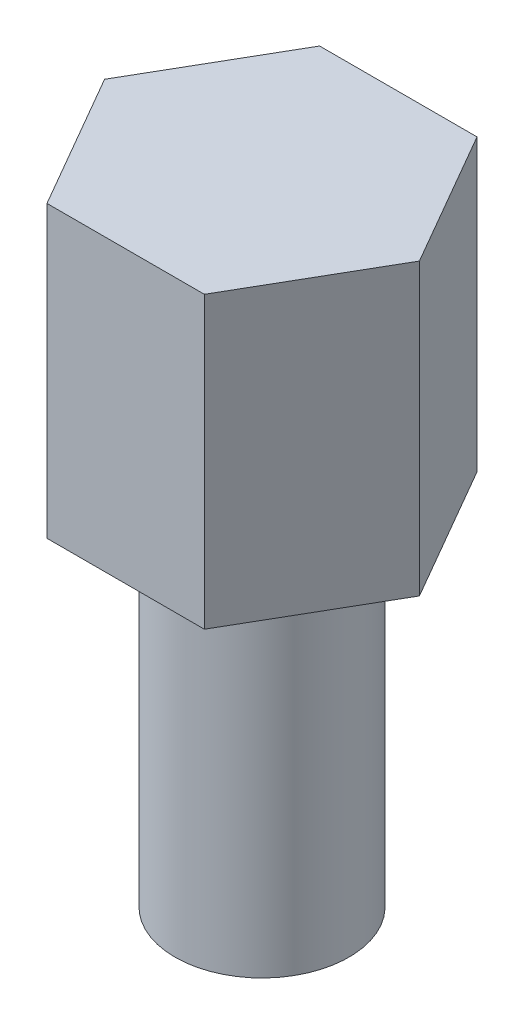
ISO-10303-21;
HEADER;
FILE_DESCRIPTION(('STEP AP214'),'2;1');
FILE_NAME('part.step','',(''),(''),'','','');
FILE_SCHEMA(('AUTOMOTIVE_DESIGN { 1 0 10303 214 1 1 1 1 }'));
ENDSEC;
DATA;
#1=APPLICATION_CONTEXT('core data for automotive mechanical design processes');
#2=APPLICATION_PROTOCOL_DEFINITION('international standard','automotive_design',2000,#1);
#3=PRODUCT_CONTEXT('',#1,'mechanical');
#4=PRODUCT('Part','Part','',(#3));
#5=PRODUCT_RELATED_PRODUCT_CATEGORY('part','',(#4));
#6=PRODUCT_DEFINITION_FORMATION('','',#4);
#7=PRODUCT_DEFINITION_CONTEXT('part definition',#1,'design');
#8=PRODUCT_DEFINITION('design','',#6,#7);
#9=PRODUCT_DEFINITION_SHAPE('','',#8);
#10=(LENGTH_UNIT() NAMED_UNIT(*) SI_UNIT(.MILLI.,.METRE.));
#11=(NAMED_UNIT(*) PLANE_ANGLE_UNIT() SI_UNIT($,.RADIAN.));
#12=(NAMED_UNIT(*) SI_UNIT($,.STERADIAN.) SOLID_ANGLE_UNIT());
#13=UNCERTAINTY_MEASURE_WITH_UNIT(LENGTH_MEASURE(1.E-05),#10,'distance_accuracy_value','');
#14=(GEOMETRIC_REPRESENTATION_CONTEXT(3) GLOBAL_UNCERTAINTY_ASSIGNED_CONTEXT((#13)) GLOBAL_UNIT_ASSIGNED_CONTEXT((#10,
#11,#12)) REPRESENTATION_CONTEXT('',''));
#15=CARTESIAN_POINT('',(0.,0.,0.));
#16=DIRECTION('',(0.,0.,1.));
#17=DIRECTION('',(1.,0.,0.));
#18=AXIS2_PLACEMENT_3D('',#15,#16,#17);
#19=CARTESIAN_POINT('',(1.35677313259562,5.,-2.35));
#20=DIRECTION('',(0.,0.,1.));
#21=DIRECTION('',(1.,0.,0.));
#22=AXIS2_PLACEMENT_3D('',#19,#20,#21);
#23=PLANE('',#22);
#24=DIRECTION('',(-1.,0.,0.));
#25=VECTOR('',#24,1.);
#26=CARTESIAN_POINT('',(1.35677313259562,0.,-2.35));
#27=LINE('',#26,#25);
#28=CARTESIAN_POINT('',(1.35677313259562,0.,-2.35));
#29=VERTEX_POINT('',#28);
#30=CARTESIAN_POINT('',(-1.35677313259562,0.,-2.35));
#31=VERTEX_POINT('',#30);
#32=EDGE_CURVE('E120',#29,#31,#27,.T.);
#33=ORIENTED_EDGE('',*,*,#32,.T.);
#34=DIRECTION('',(0.,-1.,0.));
#35=VECTOR('',#34,1.);
#36=CARTESIAN_POINT('',(-1.35677313259562,5.,-2.35));
#37=LINE('',#36,#35);
#38=CARTESIAN_POINT('',(-1.35677313259562,5.,-2.35));
#39=VERTEX_POINT('',#38);
#40=EDGE_CURVE('E43',#39,#31,#37,.T.);
#41=ORIENTED_EDGE('',*,*,#40,.F.);
#42=DIRECTION('',(-1.,0.,0.));
#43=VECTOR('',#42,1.);
#44=CARTESIAN_POINT('',(1.35677313259562,5.,-2.35));
#45=LINE('',#44,#43);
#46=CARTESIAN_POINT('',(1.35677313259562,5.,-2.35));
#47=VERTEX_POINT('',#46);
#48=EDGE_CURVE('E131',#47,#39,#45,.T.);
#49=ORIENTED_EDGE('',*,*,#48,.F.);
#50=DIRECTION('',(0.,-1.,0.));
#51=VECTOR('',#50,1.);
#52=CARTESIAN_POINT('',(1.35677313259562,5.,-2.35));
#53=LINE('',#52,#51);
#54=EDGE_CURVE('E116',#47,#29,#53,.T.);
#55=ORIENTED_EDGE('',*,*,#54,.T.);
#56=EDGE_LOOP('',(#33,#41,#49,#55));
#57=FACE_BOUND('',#56,.T.);
#58=ADVANCED_FACE('F35',(#57),#23,.F.);
#59=CARTESIAN_POINT('',(-1.35677313259562,5.,-2.35));
#60=DIRECTION('',(0.866025403784439,0.,0.5));
#61=DIRECTION('',(0.5,0.,-0.866025403784439));
#62=AXIS2_PLACEMENT_3D('',#59,#60,#61);
#63=PLANE('',#62);
#64=DIRECTION('',(-0.5,0.,0.866025403784439));
#65=VECTOR('',#64,1.);
#66=CARTESIAN_POINT('',(-1.35677313259562,0.,-2.35));
#67=LINE('',#66,#65);
#68=CARTESIAN_POINT('',(-2.71354626519124,0.,0.));
#69=VERTEX_POINT('',#68);
#70=EDGE_CURVE('E123',#31,#69,#67,.T.);
#71=ORIENTED_EDGE('',*,*,#70,.T.);
#72=DIRECTION('',(0.,-1.,0.));
#73=VECTOR('',#72,1.);
#74=CARTESIAN_POINT('',(-2.71354626519124,5.,0.));
#75=LINE('',#74,#73);
#76=CARTESIAN_POINT('',(-2.71354626519124,5.,0.));
#77=VERTEX_POINT('',#76);
#78=EDGE_CURVE('E135',#77,#69,#75,.T.);
#79=ORIENTED_EDGE('',*,*,#78,.F.);
#80=DIRECTION('',(-0.5,0.,0.866025403784439));
#81=VECTOR('',#80,1.);
#82=CARTESIAN_POINT('',(-1.35677313259562,5.,-2.35));
#83=LINE('',#82,#81);
#84=EDGE_CURVE('E89',#39,#77,#83,.T.);
#85=ORIENTED_EDGE('',*,*,#84,.F.);
#86=ORIENTED_EDGE('',*,*,#40,.T.);
#87=EDGE_LOOP('',(#71,#79,#85,#86));
#88=FACE_BOUND('',#87,.T.);
#89=ADVANCED_FACE('F138',(#88),#63,.F.);
#90=CARTESIAN_POINT('',(-2.71354626519124,5.,0.));
#91=DIRECTION('',(0.866025403784438,0.,-0.5));
#92=DIRECTION('',(-0.5,0.,-0.866025403784438));
#93=AXIS2_PLACEMENT_3D('',#90,#91,#92);
#94=PLANE('',#93);
#95=DIRECTION('',(0.5,0.,0.866025403784438));
#96=VECTOR('',#95,1.);
#97=CARTESIAN_POINT('',(-2.71354626519124,0.,0.));
#98=LINE('',#97,#96);
#99=CARTESIAN_POINT('',(-1.35677313259562,0.,2.35));
#100=VERTEX_POINT('',#99);
#101=EDGE_CURVE('E126',#69,#100,#98,.T.);
#102=ORIENTED_EDGE('',*,*,#101,.T.);
#103=DIRECTION('',(0.,-1.,0.));
#104=VECTOR('',#103,1.);
#105=CARTESIAN_POINT('',(-1.35677313259562,5.,2.35));
#106=LINE('',#105,#104);
#107=CARTESIAN_POINT('',(-1.35677313259562,5.,2.35));
#108=VERTEX_POINT('',#107);
#109=EDGE_CURVE('E111',#108,#100,#106,.T.);
#110=ORIENTED_EDGE('',*,*,#109,.F.);
#111=DIRECTION('',(0.5,0.,0.866025403784438));
#112=VECTOR('',#111,1.);
#113=CARTESIAN_POINT('',(-2.71354626519124,5.,0.));
#114=LINE('',#113,#112);
#115=EDGE_CURVE('E102',#77,#108,#114,.T.);
#116=ORIENTED_EDGE('',*,*,#115,.F.);
#117=ORIENTED_EDGE('',*,*,#78,.T.);
#118=EDGE_LOOP('',(#102,#110,#116,#117));
#119=FACE_BOUND('',#118,.T.);
#120=ADVANCED_FACE('F146',(#119),#94,.F.);
#121=CARTESIAN_POINT('',(-1.35677313259562,5.,2.35));
#122=DIRECTION('',(0.,0.,-1.));
#123=DIRECTION('',(-1.,0.,0.));
#124=AXIS2_PLACEMENT_3D('',#121,#122,#123);
#125=PLANE('',#124);
#126=DIRECTION('',(1.,0.,0.));
#127=VECTOR('',#126,1.);
#128=CARTESIAN_POINT('',(-1.35677313259562,0.,2.35));
#129=LINE('',#128,#127);
#130=CARTESIAN_POINT('',(1.35677313259562,0.,2.35));
#131=VERTEX_POINT('',#130);
#132=EDGE_CURVE('E110',#100,#131,#129,.T.);
#133=ORIENTED_EDGE('',*,*,#132,.T.);
#134=DIRECTION('',(0.,-1.,0.));
#135=VECTOR('',#134,1.);
#136=CARTESIAN_POINT('',(1.35677313259562,5.,2.35));
#137=LINE('',#136,#135);
#138=CARTESIAN_POINT('',(1.35677313259562,5.,2.35));
#139=VERTEX_POINT('',#138);
#140=EDGE_CURVE('E107',#139,#131,#137,.T.);
#141=ORIENTED_EDGE('',*,*,#140,.F.);
#142=DIRECTION('',(1.,0.,0.));
#143=VECTOR('',#142,1.);
#144=CARTESIAN_POINT('',(-1.35677313259562,5.,2.35));
#145=LINE('',#144,#143);
#146=EDGE_CURVE('E96',#108,#139,#145,.T.);
#147=ORIENTED_EDGE('',*,*,#146,.F.);
#148=ORIENTED_EDGE('',*,*,#109,.T.);
#149=EDGE_LOOP('',(#133,#141,#147,#148));
#150=FACE_BOUND('',#149,.T.);
#151=ADVANCED_FACE('F108',(#150),#125,.F.);
#152=CARTESIAN_POINT('',(1.35677313259562,5.,2.35));
#153=DIRECTION('',(-0.866025403784439,0.,-0.5));
#154=DIRECTION('',(-0.5,0.,0.866025403784439));
#155=AXIS2_PLACEMENT_3D('',#152,#153,#154);
#156=PLANE('',#155);
#157=DIRECTION('',(0.5,0.,-0.866025403784439));
#158=VECTOR('',#157,1.);
#159=CARTESIAN_POINT('',(1.35677313259562,0.,2.35));
#160=LINE('',#159,#158);
#161=CARTESIAN_POINT('',(2.71354626519124,0.,0.));
#162=VERTEX_POINT('',#161);
#163=EDGE_CURVE('E74',#131,#162,#160,.T.);
#164=ORIENTED_EDGE('',*,*,#163,.T.);
#165=DIRECTION('',(0.,-1.,0.));
#166=VECTOR('',#165,1.);
#167=CARTESIAN_POINT('',(2.71354626519124,5.,0.));
#168=LINE('',#167,#166);
#169=CARTESIAN_POINT('',(2.71354626519124,5.,0.));
#170=VERTEX_POINT('',#169);
#171=EDGE_CURVE('E112',#170,#162,#168,.T.);
#172=ORIENTED_EDGE('',*,*,#171,.F.);
#173=DIRECTION('',(0.5,0.,-0.866025403784439));
#174=VECTOR('',#173,1.);
#175=CARTESIAN_POINT('',(1.35677313259562,5.,2.35));
#176=LINE('',#175,#174);
#177=EDGE_CURVE('E100',#139,#170,#176,.T.);
#178=ORIENTED_EDGE('',*,*,#177,.F.);
#179=ORIENTED_EDGE('',*,*,#140,.T.);
#180=EDGE_LOOP('',(#164,#172,#178,#179));
#181=FACE_BOUND('',#180,.T.);
#182=ADVANCED_FACE('F114',(#181),#156,.F.);
#183=CARTESIAN_POINT('',(2.71354626519124,5.,0.));
#184=DIRECTION('',(-0.866025403784439,0.,0.5));
#185=DIRECTION('',(0.5,0.,0.866025403784439));
#186=AXIS2_PLACEMENT_3D('',#183,#184,#185);
#187=PLANE('',#186);
#188=DIRECTION('',(-0.5,0.,-0.866025403784439));
#189=VECTOR('',#188,1.);
#190=CARTESIAN_POINT('',(2.71354626519124,0.,0.));
#191=LINE('',#190,#189);
#192=EDGE_CURVE('E80',#162,#29,#191,.T.);
#193=ORIENTED_EDGE('',*,*,#192,.T.);
#194=ORIENTED_EDGE('',*,*,#54,.F.);
#195=DIRECTION('',(-0.5,0.,-0.866025403784439));
#196=VECTOR('',#195,1.);
#197=CARTESIAN_POINT('',(2.71354626519124,5.,0.));
#198=LINE('',#197,#196);
#199=EDGE_CURVE('E51',#170,#47,#198,.T.);
#200=ORIENTED_EDGE('',*,*,#199,.F.);
#201=ORIENTED_EDGE('',*,*,#171,.T.);
#202=EDGE_LOOP('',(#193,#194,#200,#201));
#203=FACE_BOUND('',#202,.T.);
#204=ADVANCED_FACE('F166',(#203),#187,.F.);
#205=CARTESIAN_POINT('',(0.,5.,0.));
#206=DIRECTION('',(0.,1.,0.));
#207=DIRECTION('',(0.,0.,1.));
#208=AXIS2_PLACEMENT_3D('',#205,#206,#207);
#209=PLANE('',#208);
#210=ORIENTED_EDGE('',*,*,#48,.T.);
#211=ORIENTED_EDGE('',*,*,#84,.T.);
#212=ORIENTED_EDGE('',*,*,#115,.T.);
#213=ORIENTED_EDGE('',*,*,#146,.T.);
#214=ORIENTED_EDGE('',*,*,#177,.T.);
#215=ORIENTED_EDGE('',*,*,#199,.T.);
#216=EDGE_LOOP('',(#210,#211,#212,#213,#214,#215));
#217=FACE_BOUND('',#216,.T.);
#218=ADVANCED_FACE('F98',(#217),#209,.T.);
#219=CARTESIAN_POINT('',(0.,0.,0.));
#220=DIRECTION('',(0.,1.,0.));
#221=DIRECTION('',(0.,0.,1.));
#222=AXIS2_PLACEMENT_3D('',#219,#220,#221);
#223=PLANE('',#222);
#224=CARTESIAN_POINT('',(0.,0.,0.));
#225=DIRECTION('',(0.,1.,0.));
#226=DIRECTION('',(0.,0.,1.));
#227=AXIS2_PLACEMENT_3D('',#224,#225,#226);
#228=CIRCLE('',#227,1.5);
#229=CARTESIAN_POINT('',(0.,0.,1.5));
#230=VERTEX_POINT('',#229);
#231=EDGE_CURVE('E11',#230,#230,#228,.F.);
#232=ORIENTED_EDGE('',*,*,#231,.F.);
#233=EDGE_LOOP('',(#232));
#234=FACE_BOUND('',#233,.T.);
#235=ORIENTED_EDGE('',*,*,#32,.F.);
#236=ORIENTED_EDGE('',*,*,#192,.F.);
#237=ORIENTED_EDGE('',*,*,#163,.F.);
#238=ORIENTED_EDGE('',*,*,#132,.F.);
#239=ORIENTED_EDGE('',*,*,#101,.F.);
#240=ORIENTED_EDGE('',*,*,#70,.F.);
#241=EDGE_LOOP('',(#235,#236,#237,#238,#239,#240));
#242=FACE_BOUND('',#241,.T.);
#243=ADVANCED_FACE('F143',(#234,#242),#223,.F.);
#244=CARTESIAN_POINT('',(0.,-6.,0.));
#245=DIRECTION('',(0.,1.,0.));
#246=DIRECTION('',(0.,0.,1.));
#247=AXIS2_PLACEMENT_3D('',#244,#245,#246);
#248=CYLINDRICAL_SURFACE('',#247,1.5);
#249=CARTESIAN_POINT('',(0.,-6.,0.));
#250=DIRECTION('',(0.,-1.,0.));
#251=DIRECTION('',(0.,0.,-1.));
#252=AXIS2_PLACEMENT_3D('',#249,#250,#251);
#253=CIRCLE('',#252,1.5);
#254=CARTESIAN_POINT('',(0.,-6.,-1.5));
#255=VERTEX_POINT('',#254);
#256=EDGE_CURVE('E124',#255,#255,#253,.T.);
#257=ORIENTED_EDGE('',*,*,#256,.F.);
#258=EDGE_LOOP('',(#257));
#259=FACE_BOUND('',#258,.T.);
#260=ORIENTED_EDGE('',*,*,#231,.T.);
#261=EDGE_LOOP('',(#260));
#262=FACE_BOUND('',#261,.T.);
#263=ADVANCED_FACE('F155',(#259,#262),#248,.T.);
#264=CARTESIAN_POINT('',(0.,-6.,0.));
#265=DIRECTION('',(0.,-1.,0.));
#266=DIRECTION('',(0.,0.,-1.));
#267=AXIS2_PLACEMENT_3D('',#264,#265,#266);
#268=PLANE('',#267);
#269=ORIENTED_EDGE('',*,*,#256,.T.);
#270=EDGE_LOOP('',(#269));
#271=FACE_BOUND('',#270,.T.);
#272=ADVANCED_FACE('F153',(#271),#268,.T.);
#273=CLOSED_SHELL('',(#58,#89,#120,#151,#182,#204,#218,#243,#263,#272));
#274=MANIFOLD_SOLID_BREP('B2',#273);
#275=ADVANCED_BREP_SHAPE_REPRESENTATION('',(#18,#274),#14);
#276=SHAPE_DEFINITION_REPRESENTATION(#9,#275);
ENDSEC;
END-ISO-10303-21;
